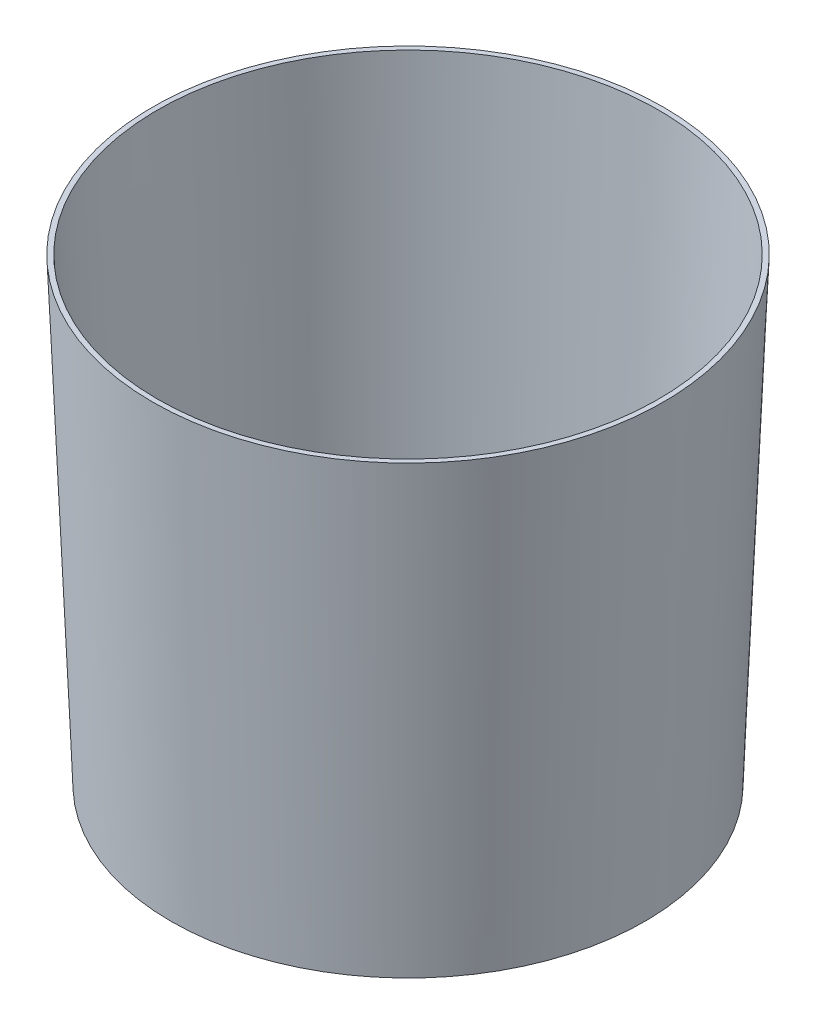
ISO-10303-21;
HEADER;
FILE_DESCRIPTION(('STEP AP214'),'2;1');
FILE_NAME('part.step','',(''),(''),'','','');
FILE_SCHEMA(('AUTOMOTIVE_DESIGN { 1 0 10303 214 1 1 1 1 }'));
ENDSEC;
DATA;
#1=APPLICATION_CONTEXT('core data for automotive mechanical design processes');
#2=APPLICATION_PROTOCOL_DEFINITION('international standard','automotive_design',2000,#1);
#3=PRODUCT_CONTEXT('',#1,'mechanical');
#4=PRODUCT('Part','Part','',(#3));
#5=PRODUCT_RELATED_PRODUCT_CATEGORY('part','',(#4));
#6=PRODUCT_DEFINITION_FORMATION('','',#4);
#7=PRODUCT_DEFINITION_CONTEXT('part definition',#1,'design');
#8=PRODUCT_DEFINITION('design','',#6,#7);
#9=PRODUCT_DEFINITION_SHAPE('','',#8);
#10=(LENGTH_UNIT() NAMED_UNIT(*) SI_UNIT(.MILLI.,.METRE.));
#11=(NAMED_UNIT(*) PLANE_ANGLE_UNIT() SI_UNIT($,.RADIAN.));
#12=(NAMED_UNIT(*) SI_UNIT($,.STERADIAN.) SOLID_ANGLE_UNIT());
#13=UNCERTAINTY_MEASURE_WITH_UNIT(LENGTH_MEASURE(1.E-05),#10,'distance_accuracy_value','');
#14=(GEOMETRIC_REPRESENTATION_CONTEXT(3) GLOBAL_UNCERTAINTY_ASSIGNED_CONTEXT((#13)) GLOBAL_UNIT_ASSIGNED_CONTEXT((#10,
#11,#12)) REPRESENTATION_CONTEXT('',''));
#15=CARTESIAN_POINT('',(0.,0.,0.));
#16=DIRECTION('',(0.,0.,1.));
#17=DIRECTION('',(1.,0.,0.));
#18=AXIS2_PLACEMENT_3D('',#15,#16,#17);
#19=CARTESIAN_POINT('',(0.,186.,0.));
#20=DIRECTION('',(0.,1.,0.));
#21=DIRECTION('',(0.,0.,1.));
#22=AXIS2_PLACEMENT_3D('',#19,#20,#21);
#23=PLANE('',#22);
#24=CARTESIAN_POINT('',(0.,186.,0.));
#25=DIRECTION('',(0.,1.,0.));
#26=DIRECTION('',(0.,0.,1.));
#27=AXIS2_PLACEMENT_3D('',#24,#25,#26);
#28=CIRCLE('',#27,101.49837474985);
#29=CARTESIAN_POINT('',(0.,186.,101.49837474985));
#30=VERTEX_POINT('',#29);
#31=EDGE_CURVE('E50',#30,#30,#28,.T.);
#32=ORIENTED_EDGE('',*,*,#31,.F.);
#33=EDGE_LOOP('',(#32));
#34=FACE_BOUND('',#33,.T.);
#35=CARTESIAN_POINT('',(0.,186.,0.));
#36=DIRECTION('',(0.,1.,0.));
#37=DIRECTION('',(0.,0.,1.));
#38=AXIS2_PLACEMENT_3D('',#35,#36,#37);
#39=CIRCLE('',#38,103.5);
#40=CARTESIAN_POINT('',(0.,186.,103.5));
#41=VERTEX_POINT('',#40);
#42=EDGE_CURVE('E11',#41,#41,#39,.T.);
#43=ORIENTED_EDGE('',*,*,#42,.T.);
#44=EDGE_LOOP('',(#43));
#45=FACE_BOUND('',#44,.T.);
#46=ADVANCED_FACE('F37',(#34,#45),#23,.T.);
#47=CARTESIAN_POINT('',(0.,0.,0.));
#48=DIRECTION('',(0.,1.,0.));
#49=DIRECTION('',(0.,0.,1.));
#50=AXIS2_PLACEMENT_3D('',#47,#48,#49);
#51=PLANE('',#50);
#52=CARTESIAN_POINT('',(0.,0.,0.));
#53=DIRECTION('',(0.,1.,0.));
#54=DIRECTION('',(0.,0.,1.));
#55=AXIS2_PLACEMENT_3D('',#52,#53,#54);
#56=CIRCLE('',#55,96.);
#57=CARTESIAN_POINT('',(0.,0.,96.));
#58=VERTEX_POINT('',#57);
#59=EDGE_CURVE('E45',#58,#58,#56,.T.);
#60=ORIENTED_EDGE('',*,*,#59,.F.);
#61=EDGE_LOOP('',(#60));
#62=FACE_BOUND('',#61,.T.);
#63=ADVANCED_FACE('F69',(#62),#51,.F.);
#64=CARTESIAN_POINT('',(0.,0.,0.));
#65=DIRECTION('',(0.,1.,0.));
#66=DIRECTION('',(0.,0.,1.));
#67=AXIS2_PLACEMENT_3D('',#64,#65,#66);
#68=CONICAL_SURFACE('',#67,96.,0.0403007483037812);
#69=ORIENTED_EDGE('',*,*,#59,.T.);
#70=EDGE_LOOP('',(#69));
#71=FACE_BOUND('',#70,.T.);
#72=ORIENTED_EDGE('',*,*,#42,.F.);
#73=EDGE_LOOP('',(#72));
#74=FACE_BOUND('',#73,.T.);
#75=ADVANCED_FACE('F78',(#71,#74),#68,.T.);
#76=CARTESIAN_POINT('',(0.,2.,0.));
#77=DIRECTION('',(0.,1.,0.));
#78=DIRECTION('',(0.,0.,1.));
#79=AXIS2_PLACEMENT_3D('',#76,#77,#78);
#80=PLANE('',#79);
#81=CARTESIAN_POINT('',(0.,2.,0.));
#82=DIRECTION('',(0.,1.,0.));
#83=DIRECTION('',(0.,0.,1.));
#84=AXIS2_PLACEMENT_3D('',#81,#82,#83);
#85=CIRCLE('',#84,94.07901991114);
#86=CARTESIAN_POINT('',(0.,2.,94.07901991114));
#87=VERTEX_POINT('',#86);
#88=EDGE_CURVE('E108',#87,#87,#85,.T.);
#89=ORIENTED_EDGE('',*,*,#88,.T.);
#90=EDGE_LOOP('',(#89));
#91=FACE_BOUND('',#90,.T.);
#92=ADVANCED_FACE('F84',(#91),#80,.T.);
#93=CARTESIAN_POINT('',(0.,0.0805796802216238,0.));
#94=DIRECTION('',(0.,1.,0.));
#95=DIRECTION('',(0.,0.,1.));
#96=AXIS2_PLACEMENT_3D('',#93,#94,#95);
#97=CONICAL_SURFACE('',#96,94.0016239305037,0.0403007483037812);
#98=ORIENTED_EDGE('',*,*,#88,.F.);
#99=EDGE_LOOP('',(#98));
#100=FACE_BOUND('',#99,.T.);
#101=ORIENTED_EDGE('',*,*,#31,.T.);
#102=EDGE_LOOP('',(#101));
#103=FACE_BOUND('',#102,.T.);
#104=ADVANCED_FACE('F80',(#100,#103),#97,.F.);
#105=CLOSED_SHELL('',(#46,#63,#75,#92,#104));
#106=MANIFOLD_SOLID_BREP('B2',#105);
#107=ADVANCED_BREP_SHAPE_REPRESENTATION('',(#18,#106),#14);
#108=SHAPE_DEFINITION_REPRESENTATION(#9,#107);
ENDSEC;
END-ISO-10303-21;
